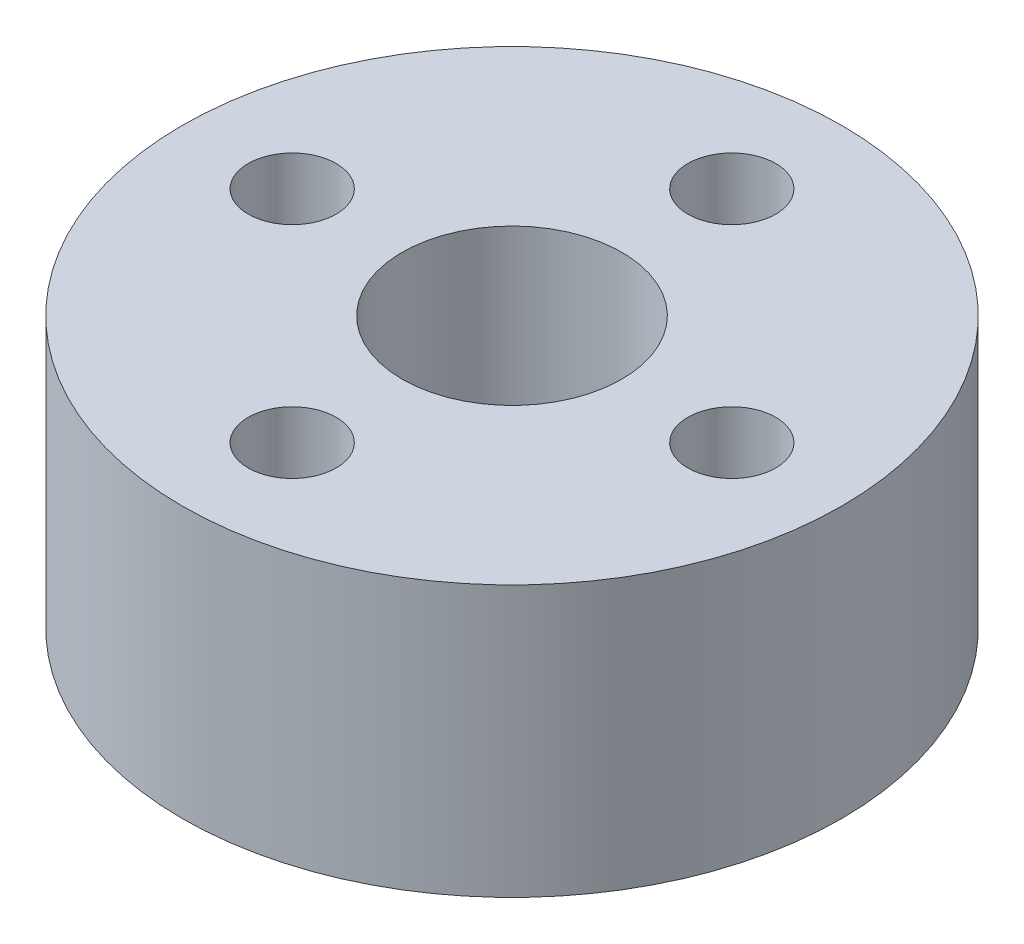
ISO-10303-21;
HEADER;
FILE_DESCRIPTION(('STEP AP214'),'2;1');
FILE_NAME('part.step','',(''),(''),'','','');
FILE_SCHEMA(('AUTOMOTIVE_DESIGN { 1 0 10303 214 1 1 1 1 }'));
ENDSEC;
DATA;
#1=APPLICATION_CONTEXT('core data for automotive mechanical design processes');
#2=APPLICATION_PROTOCOL_DEFINITION('international standard','automotive_design',2000,#1);
#3=PRODUCT_CONTEXT('',#1,'mechanical');
#4=PRODUCT('Part','Part','',(#3));
#5=PRODUCT_RELATED_PRODUCT_CATEGORY('part','',(#4));
#6=PRODUCT_DEFINITION_FORMATION('','',#4);
#7=PRODUCT_DEFINITION_CONTEXT('part definition',#1,'design');
#8=PRODUCT_DEFINITION('design','',#6,#7);
#9=PRODUCT_DEFINITION_SHAPE('','',#8);
#10=(LENGTH_UNIT() NAMED_UNIT(*) SI_UNIT(.MILLI.,.METRE.));
#11=(NAMED_UNIT(*) PLANE_ANGLE_UNIT() SI_UNIT($,.RADIAN.));
#12=(NAMED_UNIT(*) SI_UNIT($,.STERADIAN.) SOLID_ANGLE_UNIT());
#13=UNCERTAINTY_MEASURE_WITH_UNIT(LENGTH_MEASURE(1.E-05),#10,'distance_accuracy_value','');
#14=(GEOMETRIC_REPRESENTATION_CONTEXT(3) GLOBAL_UNCERTAINTY_ASSIGNED_CONTEXT((#13)) GLOBAL_UNIT_ASSIGNED_CONTEXT((#10,
#11,#12)) REPRESENTATION_CONTEXT('',''));
#15=CARTESIAN_POINT('',(0.,0.,0.));
#16=DIRECTION('',(0.,0.,1.));
#17=DIRECTION('',(1.,0.,0.));
#18=AXIS2_PLACEMENT_3D('',#15,#16,#17);
#19=CARTESIAN_POINT('',(0.,0.,0.));
#20=DIRECTION('',(0.,1.,0.));
#21=DIRECTION('',(0.,0.,1.));
#22=AXIS2_PLACEMENT_3D('',#19,#20,#21);
#23=PLANE('',#22);
#24=CARTESIAN_POINT('',(0.,0.,0.));
#25=DIRECTION('',(0.,1.,0.));
#26=DIRECTION('',(0.,0.,1.));
#27=AXIS2_PLACEMENT_3D('',#24,#25,#26);
#28=CIRCLE('',#27,25.);
#29=CARTESIAN_POINT('',(0.,0.,25.));
#30=VERTEX_POINT('',#29);
#31=EDGE_CURVE('E44',#30,#30,#28,.T.);
#32=ORIENTED_EDGE('',*,*,#31,.T.);
#33=EDGE_LOOP('',(#32));
#34=FACE_BOUND('',#33,.T.);
#35=CARTESIAN_POINT('',(0.,0.,0.));
#36=DIRECTION('',(0.,-1.,0.));
#37=DIRECTION('',(0.,0.,-1.));
#38=AXIS2_PLACEMENT_3D('',#35,#36,#37);
#39=CIRCLE('',#38,30.);
#40=CARTESIAN_POINT('',(0.,0.,-30.));
#41=VERTEX_POINT('',#40);
#42=EDGE_CURVE('E93',#41,#41,#39,.T.);
#43=ORIENTED_EDGE('',*,*,#42,.T.);
#44=EDGE_LOOP('',(#43));
#45=FACE_BOUND('',#44,.T.);
#46=ADVANCED_FACE('F37',(#34,#45),#23,.F.);
#47=CARTESIAN_POINT('',(0.,50.,0.));
#48=DIRECTION('',(0.,1.,0.));
#49=DIRECTION('',(0.,0.,1.));
#50=AXIS2_PLACEMENT_3D('',#47,#48,#49);
#51=PLANE('',#50);
#52=CARTESIAN_POINT('',(0.,50.,50.));
#53=DIRECTION('',(0.,1.,0.));
#54=DIRECTION('',(0.,0.,1.));
#55=AXIS2_PLACEMENT_3D('',#52,#53,#54);
#56=CIRCLE('',#55,10.);
#57=CARTESIAN_POINT('',(0.,50.,60.));
#58=VERTEX_POINT('',#57);
#59=EDGE_CURVE('E66',#58,#58,#56,.T.);
#60=ORIENTED_EDGE('',*,*,#59,.F.);
#61=EDGE_LOOP('',(#60));
#62=FACE_BOUND('',#61,.T.);
#63=CARTESIAN_POINT('',(50.,50.,0.));
#64=DIRECTION('',(0.,1.,0.));
#65=DIRECTION('',(0.,0.,1.));
#66=AXIS2_PLACEMENT_3D('',#63,#64,#65);
#67=CIRCLE('',#66,10.);
#68=CARTESIAN_POINT('',(50.,50.,10.));
#69=VERTEX_POINT('',#68);
#70=EDGE_CURVE('E57',#69,#69,#67,.T.);
#71=ORIENTED_EDGE('',*,*,#70,.F.);
#72=EDGE_LOOP('',(#71));
#73=FACE_BOUND('',#72,.T.);
#74=CARTESIAN_POINT('',(0.,50.,-50.));
#75=DIRECTION('',(0.,1.,0.));
#76=DIRECTION('',(0.,0.,1.));
#77=AXIS2_PLACEMENT_3D('',#74,#75,#76);
#78=CIRCLE('',#77,10.);
#79=CARTESIAN_POINT('',(0.,50.,-40.));
#80=VERTEX_POINT('',#79);
#81=EDGE_CURVE('E82',#80,#80,#78,.T.);
#82=ORIENTED_EDGE('',*,*,#81,.F.);
#83=EDGE_LOOP('',(#82));
#84=FACE_BOUND('',#83,.T.);
#85=CARTESIAN_POINT('',(-50.,50.,0.));
#86=DIRECTION('',(0.,1.,0.));
#87=DIRECTION('',(0.,0.,1.));
#88=AXIS2_PLACEMENT_3D('',#85,#86,#87);
#89=CIRCLE('',#88,10.);
#90=CARTESIAN_POINT('',(-50.,50.,10.));
#91=VERTEX_POINT('',#90);
#92=EDGE_CURVE('E73',#91,#91,#89,.T.);
#93=ORIENTED_EDGE('',*,*,#92,.F.);
#94=EDGE_LOOP('',(#93));
#95=FACE_BOUND('',#94,.T.);
#96=CARTESIAN_POINT('',(0.,50.,0.));
#97=DIRECTION('',(0.,1.,0.));
#98=DIRECTION('',(0.,0.,1.));
#99=AXIS2_PLACEMENT_3D('',#96,#97,#98);
#100=CIRCLE('',#99,25.);
#101=CARTESIAN_POINT('',(0.,50.,25.));
#102=VERTEX_POINT('',#101);
#103=EDGE_CURVE('E49',#102,#102,#100,.T.);
#104=ORIENTED_EDGE('',*,*,#103,.F.);
#105=EDGE_LOOP('',(#104));
#106=FACE_BOUND('',#105,.T.);
#107=CARTESIAN_POINT('',(0.,50.,0.));
#108=DIRECTION('',(0.,-1.,0.));
#109=DIRECTION('',(0.,0.,-1.));
#110=AXIS2_PLACEMENT_3D('',#107,#108,#109);
#111=CIRCLE('',#110,75.);
#112=CARTESIAN_POINT('',(0.,50.,-75.));
#113=VERTEX_POINT('',#112);
#114=EDGE_CURVE('E10',#113,#113,#111,.T.);
#115=ORIENTED_EDGE('',*,*,#114,.F.);
#116=EDGE_LOOP('',(#115));
#117=FACE_BOUND('',#116,.T.);
#118=ADVANCED_FACE('F120',(#62,#73,#84,#95,#106,#117),#51,.T.);
#119=CARTESIAN_POINT('',(0.,50.,0.));
#120=DIRECTION('',(0.,-1.,0.));
#121=DIRECTION('',(0.,0.,-1.));
#122=AXIS2_PLACEMENT_3D('',#119,#120,#121);
#123=CYLINDRICAL_SURFACE('',#122,75.);
#124=ORIENTED_EDGE('',*,*,#114,.T.);
#125=EDGE_LOOP('',(#124));
#126=FACE_BOUND('',#125,.T.);
#127=CARTESIAN_POINT('',(0.,-11.56865,0.));
#128=DIRECTION('',(0.,-1.,0.));
#129=DIRECTION('',(0.,0.,-1.));
#130=AXIS2_PLACEMENT_3D('',#127,#128,#129);
#131=CIRCLE('',#130,75.);
#132=CARTESIAN_POINT('',(0.,-11.56865,-75.));
#133=VERTEX_POINT('',#132);
#134=EDGE_CURVE('E78',#133,#133,#131,.T.);
#135=ORIENTED_EDGE('',*,*,#134,.F.);
#136=EDGE_LOOP('',(#135));
#137=FACE_BOUND('',#136,.T.);
#138=ADVANCED_FACE('F124',(#126,#137),#123,.T.);
#139=CARTESIAN_POINT('',(0.,0.,0.));
#140=DIRECTION('',(0.,1.,0.));
#141=DIRECTION('',(0.,0.,1.));
#142=AXIS2_PLACEMENT_3D('',#139,#140,#141);
#143=CYLINDRICAL_SURFACE('',#142,25.);
#144=ORIENTED_EDGE('',*,*,#31,.F.);
#145=EDGE_LOOP('',(#144));
#146=FACE_BOUND('',#145,.T.);
#147=ORIENTED_EDGE('',*,*,#103,.T.);
#148=EDGE_LOOP('',(#147));
#149=FACE_BOUND('',#148,.T.);
#150=ADVANCED_FACE('F131',(#146,#149),#143,.F.);
#151=CARTESIAN_POINT('',(-50.,0.,0.));
#152=DIRECTION('',(0.,1.,0.));
#153=DIRECTION('',(0.,0.,1.));
#154=AXIS2_PLACEMENT_3D('',#151,#152,#153);
#155=CYLINDRICAL_SURFACE('',#154,10.);
#156=CARTESIAN_POINT('',(-50.,0.,0.));
#157=DIRECTION('',(0.,1.,0.));
#158=DIRECTION('',(0.,0.,1.));
#159=AXIS2_PLACEMENT_3D('',#156,#157,#158);
#160=CIRCLE('',#159,10.);
#161=CARTESIAN_POINT('',(-50.,0.,10.));
#162=VERTEX_POINT('',#161);
#163=EDGE_CURVE('E77',#162,#162,#160,.T.);
#164=ORIENTED_EDGE('',*,*,#163,.F.);
#165=EDGE_LOOP('',(#164));
#166=FACE_BOUND('',#165,.T.);
#167=ORIENTED_EDGE('',*,*,#92,.T.);
#168=EDGE_LOOP('',(#167));
#169=FACE_BOUND('',#168,.T.);
#170=ADVANCED_FACE('F138',(#166,#169),#155,.F.);
#171=CARTESIAN_POINT('',(0.,0.,-50.));
#172=DIRECTION('',(0.,1.,0.));
#173=DIRECTION('',(0.,0.,1.));
#174=AXIS2_PLACEMENT_3D('',#171,#172,#173);
#175=CYLINDRICAL_SURFACE('',#174,10.);
#176=CARTESIAN_POINT('',(0.,0.,-50.));
#177=DIRECTION('',(0.,1.,0.));
#178=DIRECTION('',(0.,0.,1.));
#179=AXIS2_PLACEMENT_3D('',#176,#177,#178);
#180=CIRCLE('',#179,10.);
#181=CARTESIAN_POINT('',(0.,0.,-40.));
#182=VERTEX_POINT('',#181);
#183=EDGE_CURVE('E62',#182,#182,#180,.T.);
#184=ORIENTED_EDGE('',*,*,#183,.F.);
#185=EDGE_LOOP('',(#184));
#186=FACE_BOUND('',#185,.T.);
#187=ORIENTED_EDGE('',*,*,#81,.T.);
#188=EDGE_LOOP('',(#187));
#189=FACE_BOUND('',#188,.T.);
#190=ADVANCED_FACE('F143',(#186,#189),#175,.F.);
#191=CARTESIAN_POINT('',(50.,0.,0.));
#192=DIRECTION('',(0.,1.,0.));
#193=DIRECTION('',(0.,0.,1.));
#194=AXIS2_PLACEMENT_3D('',#191,#192,#193);
#195=CYLINDRICAL_SURFACE('',#194,10.);
#196=CARTESIAN_POINT('',(50.,0.,0.));
#197=DIRECTION('',(0.,1.,0.));
#198=DIRECTION('',(0.,0.,1.));
#199=AXIS2_PLACEMENT_3D('',#196,#197,#198);
#200=CIRCLE('',#199,10.);
#201=CARTESIAN_POINT('',(50.,0.,10.));
#202=VERTEX_POINT('',#201);
#203=EDGE_CURVE('E61',#202,#202,#200,.T.);
#204=ORIENTED_EDGE('',*,*,#203,.F.);
#205=EDGE_LOOP('',(#204));
#206=FACE_BOUND('',#205,.T.);
#207=ORIENTED_EDGE('',*,*,#70,.T.);
#208=EDGE_LOOP('',(#207));
#209=FACE_BOUND('',#208,.T.);
#210=ADVANCED_FACE('F140',(#206,#209),#195,.F.);
#211=CARTESIAN_POINT('',(0.,0.,50.));
#212=DIRECTION('',(0.,1.,0.));
#213=DIRECTION('',(0.,0.,1.));
#214=AXIS2_PLACEMENT_3D('',#211,#212,#213);
#215=CYLINDRICAL_SURFACE('',#214,10.);
#216=CARTESIAN_POINT('',(0.,0.,50.));
#217=DIRECTION('',(0.,1.,0.));
#218=DIRECTION('',(0.,0.,1.));
#219=AXIS2_PLACEMENT_3D('',#216,#217,#218);
#220=CIRCLE('',#219,10.);
#221=CARTESIAN_POINT('',(0.,0.,60.));
#222=VERTEX_POINT('',#221);
#223=EDGE_CURVE('E55',#222,#222,#220,.T.);
#224=ORIENTED_EDGE('',*,*,#223,.F.);
#225=EDGE_LOOP('',(#224));
#226=FACE_BOUND('',#225,.T.);
#227=ORIENTED_EDGE('',*,*,#59,.T.);
#228=EDGE_LOOP('',(#227));
#229=FACE_BOUND('',#228,.T.);
#230=ADVANCED_FACE('F117',(#226,#229),#215,.F.);
#231=CARTESIAN_POINT('',(0.,-11.56865,0.));
#232=DIRECTION('',(0.,1.,0.));
#233=DIRECTION('',(0.,0.,1.));
#234=AXIS2_PLACEMENT_3D('',#231,#232,#233);
#235=CYLINDRICAL_SURFACE('',#234,30.);
#236=CARTESIAN_POINT('',(0.,-11.56865,0.));
#237=DIRECTION('',(0.,-1.,0.));
#238=DIRECTION('',(0.,0.,-1.));
#239=AXIS2_PLACEMENT_3D('',#236,#237,#238);
#240=CIRCLE('',#239,30.);
#241=CARTESIAN_POINT('',(0.,-11.56865,-30.));
#242=VERTEX_POINT('',#241);
#243=EDGE_CURVE('E92',#242,#242,#240,.T.);
#244=ORIENTED_EDGE('',*,*,#243,.T.);
#245=EDGE_LOOP('',(#244));
#246=FACE_BOUND('',#245,.T.);
#247=ORIENTED_EDGE('',*,*,#42,.F.);
#248=EDGE_LOOP('',(#247));
#249=FACE_BOUND('',#248,.T.);
#250=ADVANCED_FACE('F101',(#246,#249),#235,.F.);
#251=CARTESIAN_POINT('',(0.,-11.56865,0.));
#252=DIRECTION('',(0.,-1.,0.));
#253=DIRECTION('',(0.,0.,-1.));
#254=AXIS2_PLACEMENT_3D('',#251,#252,#253);
#255=PLANE('',#254);
#256=ORIENTED_EDGE('',*,*,#134,.T.);
#257=EDGE_LOOP('',(#256));
#258=FACE_BOUND('',#257,.T.);
#259=ORIENTED_EDGE('',*,*,#243,.F.);
#260=EDGE_LOOP('',(#259));
#261=FACE_BOUND('',#260,.T.);
#262=ADVANCED_FACE('F104',(#258,#261),#255,.T.);
#263=CARTESIAN_POINT('',(0.,0.,0.));
#264=DIRECTION('',(0.,-1.,0.));
#265=DIRECTION('',(0.,0.,-1.));
#266=AXIS2_PLACEMENT_3D('',#263,#264,#265);
#267=PLANE('',#266);
#268=ORIENTED_EDGE('',*,*,#163,.T.);
#269=EDGE_LOOP('',(#268));
#270=FACE_BOUND('',#269,.T.);
#271=ADVANCED_FACE('F106',(#270),#267,.F.);
#272=ORIENTED_EDGE('',*,*,#183,.T.);
#273=EDGE_LOOP('',(#272));
#274=FACE_BOUND('',#273,.T.);
#275=ADVANCED_FACE('F113',(#274),#267,.F.);
#276=ORIENTED_EDGE('',*,*,#203,.T.);
#277=EDGE_LOOP('',(#276));
#278=FACE_BOUND('',#277,.T.);
#279=ADVANCED_FACE('F154',(#278),#267,.F.);
#280=ORIENTED_EDGE('',*,*,#223,.T.);
#281=EDGE_LOOP('',(#280));
#282=FACE_BOUND('',#281,.T.);
#283=ADVANCED_FACE('F116',(#282),#267,.F.);
#284=CLOSED_SHELL('',(#46,#118,#138,#150,#170,#190,#210,#230,#250,#262,#271,#275,#279,#283));
#285=MANIFOLD_SOLID_BREP('B2',#284);
#286=ADVANCED_BREP_SHAPE_REPRESENTATION('',(#18,#285),#14);
#287=SHAPE_DEFINITION_REPRESENTATION(#9,#286);
ENDSEC;
END-ISO-10303-21;
